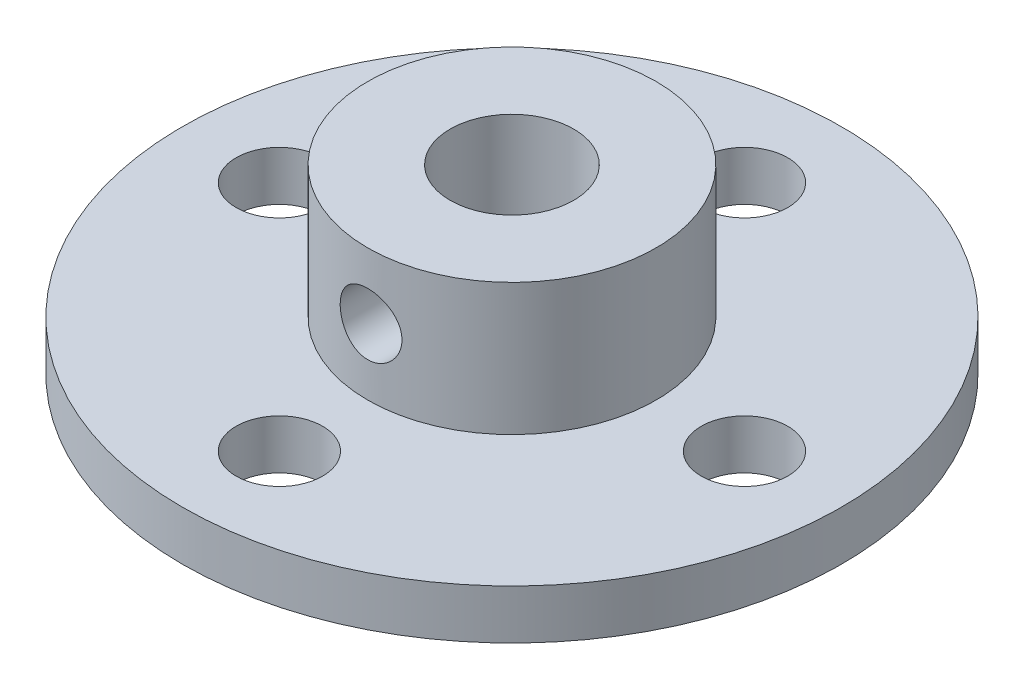
ISO-10303-21;
HEADER;
FILE_DESCRIPTION(('STEP AP214'),'2;1');
FILE_NAME('part.step','',(''),(''),'','','');
FILE_SCHEMA(('AUTOMOTIVE_DESIGN { 1 0 10303 214 1 1 1 1 }'));
ENDSEC;
DATA;
#1=APPLICATION_CONTEXT('core data for automotive mechanical design processes');
#2=APPLICATION_PROTOCOL_DEFINITION('international standard','automotive_design',2000,#1);
#3=PRODUCT_CONTEXT('',#1,'mechanical');
#4=PRODUCT('Part','Part','',(#3));
#5=PRODUCT_RELATED_PRODUCT_CATEGORY('part','',(#4));
#6=PRODUCT_DEFINITION_FORMATION('','',#4);
#7=PRODUCT_DEFINITION_CONTEXT('part definition',#1,'design');
#8=PRODUCT_DEFINITION('design','',#6,#7);
#9=PRODUCT_DEFINITION_SHAPE('','',#8);
#10=(LENGTH_UNIT() NAMED_UNIT(*) SI_UNIT(.MILLI.,.METRE.));
#11=(NAMED_UNIT(*) PLANE_ANGLE_UNIT() SI_UNIT($,.RADIAN.));
#12=(NAMED_UNIT(*) SI_UNIT($,.STERADIAN.) SOLID_ANGLE_UNIT());
#13=UNCERTAINTY_MEASURE_WITH_UNIT(LENGTH_MEASURE(1.E-05),#10,'distance_accuracy_value','');
#14=(GEOMETRIC_REPRESENTATION_CONTEXT(3) GLOBAL_UNCERTAINTY_ASSIGNED_CONTEXT((#13)) GLOBAL_UNIT_ASSIGNED_CONTEXT((#10,
#11,#12)) REPRESENTATION_CONTEXT('',''));
#15=CARTESIAN_POINT('',(0.,0.,0.));
#16=DIRECTION('',(0.,0.,1.));
#17=DIRECTION('',(1.,0.,0.));
#18=AXIS2_PLACEMENT_3D('',#15,#16,#17);
#19=CARTESIAN_POINT('',(0.,8.8,0.));
#20=DIRECTION('',(0.,-1.,0.));
#21=DIRECTION('',(0.,0.,-1.));
#22=AXIS2_PLACEMENT_3D('',#19,#20,#21);
#23=CYLINDRICAL_SURFACE('',#22,7.);
#24=CARTESIAN_POINT('',(0.,2.4,0.));
#25=DIRECTION('',(0.,1.,0.));
#26=DIRECTION('',(0.,0.,1.));
#27=AXIS2_PLACEMENT_3D('',#24,#25,#26);
#28=CIRCLE('',#27,7.);
#29=CARTESIAN_POINT('',(0.,2.4,7.));
#30=VERTEX_POINT('',#29);
#31=EDGE_CURVE('E43',#30,#30,#28,.T.);
#32=ORIENTED_EDGE('',*,*,#31,.T.);
#33=EDGE_LOOP('',(#32));
#34=FACE_BOUND('',#33,.T.);
#35=CARTESIAN_POINT('',(0.,8.8,0.));
#36=DIRECTION('',(0.,1.,0.));
#37=DIRECTION('',(0.,0.,1.));
#38=AXIS2_PLACEMENT_3D('',#35,#36,#37);
#39=CIRCLE('',#38,7.);
#40=CARTESIAN_POINT('',(0.,8.8,7.));
#41=VERTEX_POINT('',#40);
#42=EDGE_CURVE('E41',#41,#41,#39,.T.);
#43=ORIENTED_EDGE('',*,*,#42,.F.);
#44=EDGE_LOOP('',(#43));
#45=FACE_BOUND('',#44,.T.);
#46=CARTESIAN_POINT('',(-1.5,5.6,6.83739716558867));
#47=CARTESIAN_POINT('',(-1.49999708238613,5.68321115248195,6.83739884558951));
#48=CARTESIAN_POINT('',(-1.49305236244768,5.76645777394212,6.83893272341929));
#49=CARTESIAN_POINT('',(-1.46548559252999,5.93058667224201,6.84489178429867));
#50=CARTESIAN_POINT('',(-1.44485339653622,6.01146714867621,6.84931911211841));
#51=CARTESIAN_POINT('',(-1.39058863684599,6.16846574957421,6.86054115293409));
#52=CARTESIAN_POINT('',(-1.35697000991314,6.24458887812147,6.86733332725825));
#53=CARTESIAN_POINT('',(-1.27772617673341,6.39011527394461,6.88251670848644));
#54=CARTESIAN_POINT('',(-1.23210132048776,6.45951873702908,6.89090786877545));
#55=CARTESIAN_POINT('',(-1.12935142570221,6.59076296148212,6.90849578796654));
#56=CARTESIAN_POINT('',(-1.07206859483983,6.65247887623996,6.91770249871754));
#57=CARTESIAN_POINT('',(-0.947969508129578,6.76550355440579,6.93579691710397));
#58=CARTESIAN_POINT('',(-0.881152530217676,6.81681152886007,6.94468460051417));
#59=CARTESIAN_POINT('',(-0.739047288464583,6.90805544449143,6.96124769109432));
#60=CARTESIAN_POINT('',(-0.663680488229954,6.94787165577062,6.96890998819429));
#61=CARTESIAN_POINT('',(-0.507134269342596,7.01422769144629,6.98204671042934));
#62=CARTESIAN_POINT('',(-0.425955477380313,7.04076894478628,6.98752137103329));
#63=CARTESIAN_POINT('',(-0.261387187671512,7.07942997093134,6.9955956528118));
#64=CARTESIAN_POINT('',(-0.178049400596924,7.09176092855243,6.99823733378385));
#65=CARTESIAN_POINT('',(-0.0104489453066455,7.10231127731326,7.00049362207002));
#66=CARTESIAN_POINT('',(0.0738136201647584,7.10053222056076,7.00010856232698));
#67=CARTESIAN_POINT('',(0.239417029250511,7.08307103533642,6.99638700862558));
#68=CARTESIAN_POINT('',(0.320783115362112,7.06761649971008,6.99309883152432));
#69=CARTESIAN_POINT('',(0.479739463978388,7.02360531814814,6.98399541589104));
#70=CARTESIAN_POINT('',(0.557329560175053,6.99504809570026,6.97818006616518));
#71=CARTESIAN_POINT('',(0.707167497556552,6.92543854111148,6.96459754646858));
#72=CARTESIAN_POINT('',(0.779373657015788,6.88429923279565,6.95681685803946));
#73=CARTESIAN_POINT('',(0.915940926562845,6.7907580318364,6.94015793743865));
#74=CARTESIAN_POINT('',(0.980301006451527,6.7383546626997,6.93127956144693));
#75=CARTESIAN_POINT('',(1.10070208800198,6.62253145547214,6.91319326460925));
#76=CARTESIAN_POINT('',(1.1565511732025,6.55891242064297,6.90398230372853));
#77=CARTESIAN_POINT('',(1.25682243234728,6.42311671493149,6.88643566831974));
#78=CARTESIAN_POINT('',(1.30124432118068,6.35093983059475,6.87810001563387));
#79=CARTESIAN_POINT('',(1.37748077573296,6.19977549893624,6.86324023586723));
#80=CARTESIAN_POINT('',(1.40926035088923,6.12076987614756,6.85672115127775));
#81=CARTESIAN_POINT('',(1.45903495159115,5.95836723405356,6.84630340806617));
#82=CARTESIAN_POINT('',(1.47703206694628,5.87497088255681,6.84240435218483));
#83=CARTESIAN_POINT('',(1.49843586024652,5.70790424735029,6.83774881255446));
#84=CARTESIAN_POINT('',(1.5021214192864,5.6242713249227,6.83693227051701));
#85=CARTESIAN_POINT('',(1.49555139642373,5.45758600681831,6.83837239573994));
#86=CARTESIAN_POINT('',(1.48529673081635,5.37453357334645,6.84062886101063));
#87=CARTESIAN_POINT('',(1.45137894635584,5.21232956501924,6.84790415484206));
#88=CARTESIAN_POINT('',(1.42786830251553,5.13314456740304,6.85289155274364));
#89=CARTESIAN_POINT('',(1.36827052946749,4.97983766246708,6.86503859869777));
#90=CARTESIAN_POINT('',(1.33218223662818,4.90571622436581,6.87219844772849));
#91=CARTESIAN_POINT('',(1.24783504416705,4.76343031524108,6.88801634080345));
#92=CARTESIAN_POINT('',(1.19940368590792,4.69537041798782,6.89669501746317));
#93=CARTESIAN_POINT('',(1.09197183833601,4.56824165412621,6.91451775360139));
#94=CARTESIAN_POINT('',(1.03297009182161,4.50917385855153,6.92366186834461));
#95=CARTESIAN_POINT('',(0.904812764420813,4.40062969705524,6.94158239990173));
#96=CARTESIAN_POINT('',(0.83549492582877,4.35134308384299,6.95034935607746));
#97=CARTESIAN_POINT('',(0.689401481282275,4.26511459064895,6.96635610714901));
#98=CARTESIAN_POINT('',(0.612626216043739,4.22817214702717,6.97359597176692));
#99=CARTESIAN_POINT('',(0.45426541898204,4.16794794536152,6.98569278381574));
#100=CARTESIAN_POINT('',(0.372713193075172,4.14458169625372,6.99056443803698));
#101=CARTESIAN_POINT('',(0.206725177003289,4.11190829426768,6.9974393930198));
#102=CARTESIAN_POINT('',(0.122289789973993,4.10259918402609,6.99944309312296));
#103=CARTESIAN_POINT('',(-0.0452637170528291,4.09838934758814,7.00034511009057));
#104=CARTESIAN_POINT('',(-0.128374505509229,4.10320484139538,6.99930459001667));
#105=CARTESIAN_POINT('',(-0.292572938415961,4.12647476351903,6.99436552363383));
#106=CARTESIAN_POINT('',(-0.373660616405285,4.14492896557832,6.99046702473686));
#107=CARTESIAN_POINT('',(-0.53130194848727,4.19481880624949,6.98025388638537));
#108=CARTESIAN_POINT('',(-0.607868365073178,4.22621568938556,6.97394646430493));
#109=CARTESIAN_POINT('',(-0.75468495672322,4.30106127116912,6.95959036050661));
#110=CARTESIAN_POINT('',(-0.824934544796142,4.34451108830603,6.9515415172034));
#111=CARTESIAN_POINT('',(-0.958512306895244,4.44316231874267,6.93439809934493));
#112=CARTESIAN_POINT('',(-1.02169036510578,4.49856415832131,6.92528708907874));
#113=CARTESIAN_POINT('',(-1.13795001457643,4.61914061025035,6.90713690075836));
#114=CARTESIAN_POINT('',(-1.19102918062422,4.68431756335561,6.89809774045682));
#115=CARTESIAN_POINT('',(-1.28623261596675,4.82359049318568,6.88098693651916));
#116=CARTESIAN_POINT('',(-1.32820897809616,4.89778935828702,6.87292905956533));
#117=CARTESIAN_POINT('',(-1.39903004659825,5.05234372092325,6.85886497228049));
#118=CARTESIAN_POINT('',(-1.42788606423931,5.13269384525307,6.85285699581573));
#119=CARTESIAN_POINT('',(-1.46638607121558,5.27762613118586,6.84470560641996));
#120=CARTESIAN_POINT('',(-1.47896752507743,5.34141167570783,6.84198283087953));
#121=CARTESIAN_POINT('',(-1.49577544043437,5.47012431157732,6.83832799504406));
#122=CARTESIAN_POINT('',(-1.50000227727981,5.53505135150832,6.83739585430069));
#123=CARTESIAN_POINT('',(-1.5,5.6,6.83739716558867));
#124=B_SPLINE_CURVE_WITH_KNOTS('',3,(#46,#47,#48,#49,#50,#51,#52,#53,#54,#55,#56,#57,#58,#59,
#60,#61,#62,#63,#64,#65,#66,#67,#68,#69,#70,#71,#72,#73,#74,#75,#76,#77,#78,#79,#80,#81,#82,#83,
#84,#85,#86,#87,#88,#89,#90,#91,#92,#93,#94,#95,#96,#97,#98,#99,#100,#101,#102,#103,#104,#105,
#106,#107,#108,#109,#110,#111,#112,#113,#114,#115,#116,#117,#118,#119,#120,#121,#122,#123),
.UNSPECIFIED.,.T.,.F.,(4,2,2,2,2,2,2,2,2,2,2,2,2,2,2,2,2,2,2,2,2,2,2,2,2,2,2,2,2,2,2,2,2,2,2,2,
2,2,4),(0.,0.249395482027528,0.498976038479964,0.74828949115276,0.997595676735284,
1.25053229582692,1.50348808112879,1.75899134820278,2.01446710646268,2.26609508151929,
2.51769537777241,2.76518557667372,3.01268666607584,3.26193888143437,3.51122378872315,
3.76548960779295,4.01976177023092,4.27473287411781,4.52966530953839,4.77960433192523,
5.02952692653917,5.27663180749375,5.5237595556315,5.77455010216318,6.02537049659078,
6.2806621468321,6.53594213875541,6.78961589824375,7.04325433208539,7.29183199644126,
7.54040553715099,7.78824009619483,8.03609766151365,8.28848914160965,8.54094115631232,
8.79660380167249,9.05204561611687,9.24671456122272,9.44137476018022),.UNSPECIFIED.);
#125=CARTESIAN_POINT('',(-1.5,5.6,6.83739716558867));
#126=VERTEX_POINT('',#125);
#127=EDGE_CURVE('E78',#126,#126,#124,.T.);
#128=ORIENTED_EDGE('',*,*,#127,.T.);
#129=EDGE_LOOP('',(#128));
#130=FACE_BOUND('',#129,.T.);
#131=ADVANCED_FACE('F30',(#34,#45,#130),#23,.T.);
#132=CARTESIAN_POINT('',(0.,-0.000999999999999265,0.));
#133=DIRECTION('',(0.,1.,0.));
#134=DIRECTION('',(0.,0.,1.));
#135=AXIS2_PLACEMENT_3D('',#132,#133,#134);
#136=CYLINDRICAL_SURFACE('',#135,3.);
#137=CARTESIAN_POINT('',(0.,0.,0.));
#138=DIRECTION('',(0.,1.,0.));
#139=DIRECTION('',(0.,0.,1.));
#140=AXIS2_PLACEMENT_3D('',#137,#138,#139);
#141=CIRCLE('',#140,3.);
#142=CARTESIAN_POINT('',(0.,0.,3.));
#143=VERTEX_POINT('',#142);
#144=EDGE_CURVE('E46',#143,#143,#141,.F.);
#145=ORIENTED_EDGE('',*,*,#144,.T.);
#146=EDGE_LOOP('',(#145));
#147=FACE_BOUND('',#146,.T.);
#148=CARTESIAN_POINT('',(0.,8.8,0.));
#149=DIRECTION('',(0.,1.,0.));
#150=DIRECTION('',(0.,0.,1.));
#151=AXIS2_PLACEMENT_3D('',#148,#149,#150);
#152=CIRCLE('',#151,3.);
#153=CARTESIAN_POINT('',(0.,8.8,3.));
#154=VERTEX_POINT('',#153);
#155=EDGE_CURVE('E51',#154,#154,#152,.T.);
#156=ORIENTED_EDGE('',*,*,#155,.T.);
#157=EDGE_LOOP('',(#156));
#158=FACE_BOUND('',#157,.T.);
#159=CARTESIAN_POINT('',(-1.5,5.6,2.59807621135331));
#160=CARTESIAN_POINT('',(-1.4999945446118,5.52183828770713,2.59808302092688));
#161=CARTESIAN_POINT('',(-1.49384995609983,5.44357788271243,2.60165701781635));
#162=CARTESIAN_POINT('',(-1.46958481484708,5.28945910298427,2.61543549678079));
#163=CARTESIAN_POINT('',(-1.45143909683127,5.21360612743489,2.62565391083339));
#164=CARTESIAN_POINT('',(-1.40414992304972,5.06682250348409,2.65124019908098));
#165=CARTESIAN_POINT('',(-1.3750649287406,4.99586802128962,2.66658065209878));
#166=CARTESIAN_POINT('',(-1.30690128806456,4.85986369700492,2.70063997225287));
#167=CARTESIAN_POINT('',(-1.26782210105366,4.79481417460631,2.71935902214097));
#168=CARTESIAN_POINT('',(-1.17699981079632,4.66654140716374,2.75995303586162));
#169=CARTESIAN_POINT('',(-1.12447805421566,4.60391129648969,2.7819609545693));
#170=CARTESIAN_POINT('',(-1.0098807114217,4.48788741738994,2.82557974178559));
#171=CARTESIAN_POINT('',(-0.947800388673441,4.43449825612472,2.84719040746875));
#172=CARTESIAN_POINT('',(-0.810734345121821,4.33494927327851,2.88932215429424));
#173=CARTESIAN_POINT('',(-0.735160783518864,4.28951934821071,2.90967159627259));
#174=CARTESIAN_POINT('',(-0.576235539899257,4.21228872013136,2.94526134149293));
#175=CARTESIAN_POINT('',(-0.492888807207234,4.18047941579425,2.96050486775612));
#176=CARTESIAN_POINT('',(-0.327067415888967,4.13374300804835,2.98320691866356));
#177=CARTESIAN_POINT('',(-0.244952685733227,4.1177757104667,2.99114220331338));
#178=CARTESIAN_POINT('',(-0.0788559430467729,4.09975082198744,3.00011375769101));
#179=CARTESIAN_POINT('',(0.00512490876560716,4.09768481480643,3.00115420176885));
#180=CARTESIAN_POINT('',(0.164748786635625,4.10712001095553,2.99644472874675));
#181=CARTESIAN_POINT('',(0.240481798765187,4.11745702328183,2.99127743838241));
#182=CARTESIAN_POINT('',(0.388970657877483,4.14932126585699,2.97561367889621));
#183=CARTESIAN_POINT('',(0.461726281640888,4.17084933346433,2.96511681099591));
#184=CARTESIAN_POINT('',(0.60346408735433,4.22462384913472,2.93957374931482));
#185=CARTESIAN_POINT('',(0.672380135272767,4.2570144697581,2.92446662293799));
#186=CARTESIAN_POINT('',(0.803965202269992,4.33139512430224,2.89106468980031));
#187=CARTESIAN_POINT('',(0.866631973257968,4.37338859495353,2.87276874236226));
#188=CARTESIAN_POINT('',(0.990260491347292,4.47034302729952,2.83266591598844));
#189=CARTESIAN_POINT('',(1.05050111254404,4.52615454248902,2.81069063997263));
#190=CARTESIAN_POINT('',(1.16115655544667,4.64688458739527,2.76681510880218));
#191=CARTESIAN_POINT('',(1.21156381736135,4.71181005841109,2.74491492398443));
#192=CARTESIAN_POINT('',(1.30425800196332,4.85397228863613,2.70216234138727));
#193=CARTESIAN_POINT('',(1.34582597246708,4.93172903458132,2.68146479986061));
#194=CARTESIAN_POINT('',(1.41497866950185,5.0944065070385,2.64563175417864));
#195=CARTESIAN_POINT('',(1.44257798731633,5.17931964952634,2.63049045069101));
#196=CARTESIAN_POINT('',(1.48077031653756,5.34682176692419,2.60916953725552));
#197=CARTESIAN_POINT('',(1.49253768317996,5.42906167856533,2.60237483772745));
#198=CARTESIAN_POINT('',(1.50227541991714,5.59460201227482,2.59676879042414));
#199=CARTESIAN_POINT('',(1.50025553597254,5.67790164367968,2.59795180333967));
#200=CARTESIAN_POINT('',(1.48355406501595,5.83348087786809,2.60751504810877));
#201=CARTESIAN_POINT('',(1.4702817250687,5.90596917666189,2.61509381259981));
#202=CARTESIAN_POINT('',(1.43354442694866,6.04755167940644,2.63541032327012));
#203=CARTESIAN_POINT('',(1.41007616793542,6.11664477611991,2.64814974007551));
#204=CARTESIAN_POINT('',(1.35247138290733,6.25311699635405,2.67804333119485));
#205=CARTESIAN_POINT('',(1.31789109553908,6.32026852528033,2.69537464864595));
#206=CARTESIAN_POINT('',(1.23943059602371,6.44820390730849,2.73234179245875));
#207=CARTESIAN_POINT('',(1.19554560649832,6.50898446526993,2.75197880032721));
#208=CARTESIAN_POINT('',(1.09325575079828,6.63046815128532,2.79431997684504));
#209=CARTESIAN_POINT('',(1.03371790847245,6.69019572607649,2.81709874731434));
#210=CARTESIAN_POINT('',(0.905106743097432,6.79911835699039,2.86101352466839));
#211=CARTESIAN_POINT('',(0.836030211983019,6.84830985534581,2.88214897511564));
#212=CARTESIAN_POINT('',(0.687803043838135,6.93586058892515,2.92112042536435));
#213=CARTESIAN_POINT('',(0.608434646361169,6.97389967731637,2.93885462508044));
#214=CARTESIAN_POINT('',(0.443283546961623,7.03570685578609,2.96825032438951));
#215=CARTESIAN_POINT('',(0.357506552088263,7.05948747704946,2.9799171551456));
#216=CARTESIAN_POINT('',(0.190469523495625,7.09005284626199,2.99501262272824));
#217=CARTESIAN_POINT('',(0.109517165775685,7.09819681381417,2.99909891862287));
#218=CARTESIAN_POINT('',(-0.0526889789268062,7.1012648981816,3.00063195562697));
#219=CARTESIAN_POINT('',(-0.133942650442631,7.09619364278535,2.99808102100335));
#220=CARTESIAN_POINT('',(-0.288806988475722,7.07387538980656,2.98700953256884));
#221=CARTESIAN_POINT('',(-0.362568476716897,7.05745272611349,2.97889342001985));
#222=CARTESIAN_POINT('',(-0.506168928275427,7.01400950104555,2.95788140495135));
#223=CARTESIAN_POINT('',(-0.576007327433264,6.98698741985982,2.94498481699193));
#224=CARTESIAN_POINT('',(-0.713135109367328,6.92190942175104,2.9148889612218));
#225=CARTESIAN_POINT('',(-0.78018771405007,6.88343101518824,2.89752925798199));
#226=CARTESIAN_POINT('',(-0.907161962721038,6.79706310371142,2.86032199712739));
#227=CARTESIAN_POINT('',(-0.967080311122362,6.74916927632649,2.84047329837541));
#228=CARTESIAN_POINT('',(-1.08437100623534,6.63980429146595,2.79792915339941));
#229=CARTESIAN_POINT('',(-1.14089652680891,6.57745626878421,2.77514698517547));
#230=CARTESIAN_POINT('',(-1.24299493109201,6.44382391830535,2.73094614244278));
#231=CARTESIAN_POINT('',(-1.28855812501509,6.37253176869847,2.70952868642798));
#232=CARTESIAN_POINT('',(-1.36864661967848,6.22004503012857,2.66999407957374));
#233=CARTESIAN_POINT('',(-1.40277759894141,6.1386087033069,2.65200261384405));
#234=CARTESIAN_POINT('',(-1.45631806425962,5.97000139349033,2.62299234492527));
#235=CARTESIAN_POINT('',(-1.47577678676302,5.88285066663097,2.61195024221553));
#236=CARTESIAN_POINT('',(-1.49155051179662,5.762291966522,2.60293908902686));
#237=CARTESIAN_POINT('',(-1.49471415744578,5.72994815840317,2.60112193507728));
#238=CARTESIAN_POINT('',(-1.49894010763495,5.66507527897664,2.59868903831625));
#239=CARTESIAN_POINT('',(-1.50000227159981,5.63254619542119,2.59807337587664));
#240=CARTESIAN_POINT('',(-1.5,5.6,2.59807621135331));
#241=B_SPLINE_CURVE_WITH_KNOTS('',3,(#159,#160,#161,#162,#163,#164,#165,#166,#167,#168,#169,
#170,#171,#172,#173,#174,#175,#176,#177,#178,#179,#180,#181,#182,#183,#184,#185,#186,#187,#188,
#189,#190,#191,#192,#193,#194,#195,#196,#197,#198,#199,#200,#201,#202,#203,#204,#205,#206,#207,
#208,#209,#210,#211,#212,#213,#214,#215,#216,#217,#218,#219,#220,#221,#222,#223,#224,#225,#226,
#227,#228,#229,#230,#231,#232,#233,#234,#235,#236,#237,#238,#239,#240),.UNSPECIFIED.,.T.,.F.,(4,
2,2,2,2,2,2,2,2,2,2,2,2,2,2,2,2,2,2,2,2,2,2,2,2,2,2,2,2,2,2,2,2,2,2,2,2,2,2,2,4),(0.,
0.234348183892073,0.469189339237207,0.70279289387833,0.936409088167724,1.18929346874735,
1.44230356626556,1.71236838358145,1.98226240445837,2.23295227451903,2.4834903552906,
2.71224146226808,2.94100968776183,3.1729430209672,3.40495949025408,3.65890787185336,
3.91305072368878,4.18333262594173,4.45333161317557,4.70193436281318,4.9503613978256,
5.17161275136038,5.39293578654095,5.62450944609131,5.85620229330071,6.1171011537092,
6.37808797467303,6.64596272119449,6.91360169713157,7.1566840558423,7.39968130190957,
7.62666637307239,7.85368400268019,8.09041126079208,8.32724745151078,8.58765362775101,
8.84828914267731,9.11716123557907,9.3851269950414,9.48270202777964,9.5802835874181),.UNSPECIFIED.);
#242=CARTESIAN_POINT('',(-1.5,5.6,2.59807621135331));
#243=VERTEX_POINT('',#242);
#244=EDGE_CURVE('E86',#243,#243,#241,.T.);
#245=ORIENTED_EDGE('',*,*,#244,.T.);
#246=EDGE_LOOP('',(#245));
#247=FACE_BOUND('',#246,.T.);
#248=ADVANCED_FACE('F116',(#147,#158,#247),#136,.F.);
#249=CARTESIAN_POINT('',(0.,2.4,0.));
#250=DIRECTION('',(0.,1.,0.));
#251=DIRECTION('',(0.,0.,1.));
#252=AXIS2_PLACEMENT_3D('',#249,#250,#251);
#253=PLANE('',#252);
#254=CARTESIAN_POINT('',(-11.2899999999997,2.4,3.20881099469261E-13));
#255=DIRECTION('',(0.,1.,0.));
#256=DIRECTION('',(0.,0.,1.));
#257=AXIS2_PLACEMENT_3D('',#254,#255,#256);
#258=CIRCLE('',#257,2.10000000000051);
#259=CARTESIAN_POINT('',(-11.2899999999997,2.4,2.10000000000084));
#260=VERTEX_POINT('',#259);
#261=EDGE_CURVE('E75',#260,#260,#258,.T.);
#262=ORIENTED_EDGE('',*,*,#261,.F.);
#263=EDGE_LOOP('',(#262));
#264=FACE_BOUND('',#263,.T.);
#265=CARTESIAN_POINT('',(6.38996946466048E-13,2.4,11.29));
#266=DIRECTION('',(0.,1.,0.));
#267=DIRECTION('',(0.,0.,1.));
#268=AXIS2_PLACEMENT_3D('',#265,#266,#267);
#269=CIRCLE('',#268,2.10000000000069);
#270=CARTESIAN_POINT('',(6.38996946466048E-13,2.4,13.3900000000007));
#271=VERTEX_POINT('',#270);
#272=EDGE_CURVE('E69',#271,#271,#269,.T.);
#273=ORIENTED_EDGE('',*,*,#272,.F.);
#274=EDGE_LOOP('',(#273));
#275=FACE_BOUND('',#274,.T.);
#276=CARTESIAN_POINT('',(11.2900000000003,2.4,-3.19498473233024E-13));
#277=DIRECTION('',(0.,1.,0.));
#278=DIRECTION('',(0.,0.,1.));
#279=AXIS2_PLACEMENT_3D('',#276,#277,#278);
#280=CIRCLE('',#279,2.10000000000025);
#281=CARTESIAN_POINT('',(11.2900000000003,2.4,2.09999999999993));
#282=VERTEX_POINT('',#281);
#283=EDGE_CURVE('E63',#282,#282,#280,.T.);
#284=ORIENTED_EDGE('',*,*,#283,.F.);
#285=EDGE_LOOP('',(#284));
#286=FACE_BOUND('',#285,.T.);
#287=CARTESIAN_POINT('',(0.,2.4,-11.29));
#288=DIRECTION('',(0.,1.,0.));
#289=DIRECTION('',(0.,0.,1.));
#290=AXIS2_PLACEMENT_3D('',#287,#288,#289);
#291=CIRCLE('',#290,2.1);
#292=CARTESIAN_POINT('',(0.,2.4,-9.19));
#293=VERTEX_POINT('',#292);
#294=EDGE_CURVE('E57',#293,#293,#291,.T.);
#295=ORIENTED_EDGE('',*,*,#294,.F.);
#296=EDGE_LOOP('',(#295));
#297=FACE_BOUND('',#296,.T.);
#298=CARTESIAN_POINT('',(0.,2.4,0.));
#299=DIRECTION('',(0.,1.,0.));
#300=DIRECTION('',(0.,0.,1.));
#301=AXIS2_PLACEMENT_3D('',#298,#299,#300);
#302=CIRCLE('',#301,16.);
#303=CARTESIAN_POINT('',(0.,2.4,16.));
#304=VERTEX_POINT('',#303);
#305=EDGE_CURVE('E10',#304,#304,#302,.T.);
#306=ORIENTED_EDGE('',*,*,#305,.T.);
#307=EDGE_LOOP('',(#306));
#308=FACE_BOUND('',#307,.T.);
#309=ORIENTED_EDGE('',*,*,#31,.F.);
#310=EDGE_LOOP('',(#309));
#311=FACE_BOUND('',#310,.T.);
#312=ADVANCED_FACE('F119',(#264,#275,#286,#297,#308,#311),#253,.T.);
#313=CARTESIAN_POINT('',(0.,2.4,0.));
#314=DIRECTION('',(0.,-1.,0.));
#315=DIRECTION('',(0.,0.,-1.));
#316=AXIS2_PLACEMENT_3D('',#313,#314,#315);
#317=CYLINDRICAL_SURFACE('',#316,16.);
#318=ORIENTED_EDGE('',*,*,#305,.F.);
#319=EDGE_LOOP('',(#318));
#320=FACE_BOUND('',#319,.T.);
#321=CARTESIAN_POINT('',(0.,0.,0.));
#322=DIRECTION('',(0.,1.,0.));
#323=DIRECTION('',(0.,0.,1.));
#324=AXIS2_PLACEMENT_3D('',#321,#322,#323);
#325=CIRCLE('',#324,16.);
#326=CARTESIAN_POINT('',(0.,0.,16.));
#327=VERTEX_POINT('',#326);
#328=EDGE_CURVE('E34',#327,#327,#325,.T.);
#329=ORIENTED_EDGE('',*,*,#328,.T.);
#330=EDGE_LOOP('',(#329));
#331=FACE_BOUND('',#330,.T.);
#332=ADVANCED_FACE('F32',(#320,#331),#317,.T.);
#333=CARTESIAN_POINT('',(0.,0.,0.));
#334=DIRECTION('',(0.,1.,0.));
#335=DIRECTION('',(0.,0.,1.));
#336=AXIS2_PLACEMENT_3D('',#333,#334,#335);
#337=PLANE('',#336);
#338=CARTESIAN_POINT('',(-11.2899999999997,0.,3.20881099469261E-13));
#339=DIRECTION('',(0.,1.,0.));
#340=DIRECTION('',(0.,0.,1.));
#341=AXIS2_PLACEMENT_3D('',#338,#339,#340);
#342=CIRCLE('',#341,2.10000000000051);
#343=CARTESIAN_POINT('',(-11.2899999999997,0.,2.10000000000084));
#344=VERTEX_POINT('',#343);
#345=EDGE_CURVE('E72',#344,#344,#342,.F.);
#346=ORIENTED_EDGE('',*,*,#345,.F.);
#347=EDGE_LOOP('',(#346));
#348=FACE_BOUND('',#347,.T.);
#349=CARTESIAN_POINT('',(6.38996946466048E-13,0.,11.29));
#350=DIRECTION('',(0.,1.,0.));
#351=DIRECTION('',(0.,0.,1.));
#352=AXIS2_PLACEMENT_3D('',#349,#350,#351);
#353=CIRCLE('',#352,2.10000000000069);
#354=CARTESIAN_POINT('',(6.38996946466048E-13,0.,13.3900000000007));
#355=VERTEX_POINT('',#354);
#356=EDGE_CURVE('E66',#355,#355,#353,.F.);
#357=ORIENTED_EDGE('',*,*,#356,.F.);
#358=EDGE_LOOP('',(#357));
#359=FACE_BOUND('',#358,.T.);
#360=CARTESIAN_POINT('',(11.2900000000003,0.,-3.19498473233024E-13));
#361=DIRECTION('',(0.,1.,0.));
#362=DIRECTION('',(0.,0.,1.));
#363=AXIS2_PLACEMENT_3D('',#360,#361,#362);
#364=CIRCLE('',#363,2.10000000000025);
#365=CARTESIAN_POINT('',(11.2900000000003,0.,2.09999999999993));
#366=VERTEX_POINT('',#365);
#367=EDGE_CURVE('E60',#366,#366,#364,.F.);
#368=ORIENTED_EDGE('',*,*,#367,.F.);
#369=EDGE_LOOP('',(#368));
#370=FACE_BOUND('',#369,.T.);
#371=CARTESIAN_POINT('',(0.,0.,-11.29));
#372=DIRECTION('',(0.,1.,0.));
#373=DIRECTION('',(0.,0.,1.));
#374=AXIS2_PLACEMENT_3D('',#371,#372,#373);
#375=CIRCLE('',#374,2.1);
#376=CARTESIAN_POINT('',(0.,0.,-9.19));
#377=VERTEX_POINT('',#376);
#378=EDGE_CURVE('E54',#377,#377,#375,.F.);
#379=ORIENTED_EDGE('',*,*,#378,.F.);
#380=EDGE_LOOP('',(#379));
#381=FACE_BOUND('',#380,.T.);
#382=ORIENTED_EDGE('',*,*,#144,.F.);
#383=EDGE_LOOP('',(#382));
#384=FACE_BOUND('',#383,.T.);
#385=ORIENTED_EDGE('',*,*,#328,.F.);
#386=EDGE_LOOP('',(#385));
#387=FACE_BOUND('',#386,.T.);
#388=ADVANCED_FACE('F123',(#348,#359,#370,#381,#384,#387),#337,.F.);
#389=CARTESIAN_POINT('',(0.,8.8,0.));
#390=DIRECTION('',(0.,1.,0.));
#391=DIRECTION('',(0.,0.,1.));
#392=AXIS2_PLACEMENT_3D('',#389,#390,#391);
#393=PLANE('',#392);
#394=ORIENTED_EDGE('',*,*,#155,.F.);
#395=EDGE_LOOP('',(#394));
#396=FACE_BOUND('',#395,.T.);
#397=ORIENTED_EDGE('',*,*,#42,.T.);
#398=EDGE_LOOP('',(#397));
#399=FACE_BOUND('',#398,.T.);
#400=ADVANCED_FACE('F114',(#396,#399),#393,.T.);
#401=CARTESIAN_POINT('',(0.,-0.00100000000000013,-11.29));
#402=DIRECTION('',(0.,1.,0.));
#403=DIRECTION('',(0.,0.,1.));
#404=AXIS2_PLACEMENT_3D('',#401,#402,#403);
#405=CYLINDRICAL_SURFACE('',#404,2.1);
#406=ORIENTED_EDGE('',*,*,#294,.T.);
#407=EDGE_LOOP('',(#406));
#408=FACE_BOUND('',#407,.T.);
#409=ORIENTED_EDGE('',*,*,#378,.T.);
#410=EDGE_LOOP('',(#409));
#411=FACE_BOUND('',#410,.T.);
#412=ADVANCED_FACE('F110',(#408,#411),#405,.F.);
#413=CARTESIAN_POINT('',(11.2900000000003,-0.00100000000000013,-3.19498473233024E-13));
#414=DIRECTION('',(0.,1.,0.));
#415=DIRECTION('',(0.,0.,1.));
#416=AXIS2_PLACEMENT_3D('',#413,#414,#415);
#417=CYLINDRICAL_SURFACE('',#416,2.10000000000025);
#418=ORIENTED_EDGE('',*,*,#283,.T.);
#419=EDGE_LOOP('',(#418));
#420=FACE_BOUND('',#419,.T.);
#421=ORIENTED_EDGE('',*,*,#367,.T.);
#422=EDGE_LOOP('',(#421));
#423=FACE_BOUND('',#422,.T.);
#424=ADVANCED_FACE('F106',(#420,#423),#417,.F.);
#425=CARTESIAN_POINT('',(6.38996946466048E-13,-0.00100000000000013,11.29));
#426=DIRECTION('',(0.,1.,0.));
#427=DIRECTION('',(0.,0.,1.));
#428=AXIS2_PLACEMENT_3D('',#425,#426,#427);
#429=CYLINDRICAL_SURFACE('',#428,2.10000000000069);
#430=ORIENTED_EDGE('',*,*,#272,.T.);
#431=EDGE_LOOP('',(#430));
#432=FACE_BOUND('',#431,.T.);
#433=ORIENTED_EDGE('',*,*,#356,.T.);
#434=EDGE_LOOP('',(#433));
#435=FACE_BOUND('',#434,.T.);
#436=ADVANCED_FACE('F102',(#432,#435),#429,.F.);
#437=CARTESIAN_POINT('',(-11.2899999999997,-0.00100000000000013,3.20881099469261E-13));
#438=DIRECTION('',(0.,1.,0.));
#439=DIRECTION('',(0.,0.,1.));
#440=AXIS2_PLACEMENT_3D('',#437,#438,#439);
#441=CYLINDRICAL_SURFACE('',#440,2.10000000000051);
#442=ORIENTED_EDGE('',*,*,#261,.T.);
#443=EDGE_LOOP('',(#442));
#444=FACE_BOUND('',#443,.T.);
#445=ORIENTED_EDGE('',*,*,#345,.T.);
#446=EDGE_LOOP('',(#445));
#447=FACE_BOUND('',#446,.T.);
#448=ADVANCED_FACE('F97',(#444,#447),#441,.F.);
#449=CARTESIAN_POINT('',(0.,5.6,16.001));
#450=DIRECTION('',(0.,0.,-1.));
#451=DIRECTION('',(-1.,0.,0.));
#452=AXIS2_PLACEMENT_3D('',#449,#450,#451);
#453=CYLINDRICAL_SURFACE('',#452,1.5);
#454=ORIENTED_EDGE('',*,*,#244,.F.);
#455=EDGE_LOOP('',(#454));
#456=FACE_BOUND('',#455,.T.);
#457=ORIENTED_EDGE('',*,*,#127,.F.);
#458=EDGE_LOOP('',(#457));
#459=FACE_BOUND('',#458,.T.);
#460=ADVANCED_FACE('F91',(#456,#459),#453,.F.);
#461=CLOSED_SHELL('',(#131,#248,#312,#332,#388,#400,#412,#424,#436,#448,#460));
#462=MANIFOLD_SOLID_BREP('B2',#461);
#463=ADVANCED_BREP_SHAPE_REPRESENTATION('',(#18,#462),#14);
#464=SHAPE_DEFINITION_REPRESENTATION(#9,#463);
ENDSEC;
END-ISO-10303-21;
